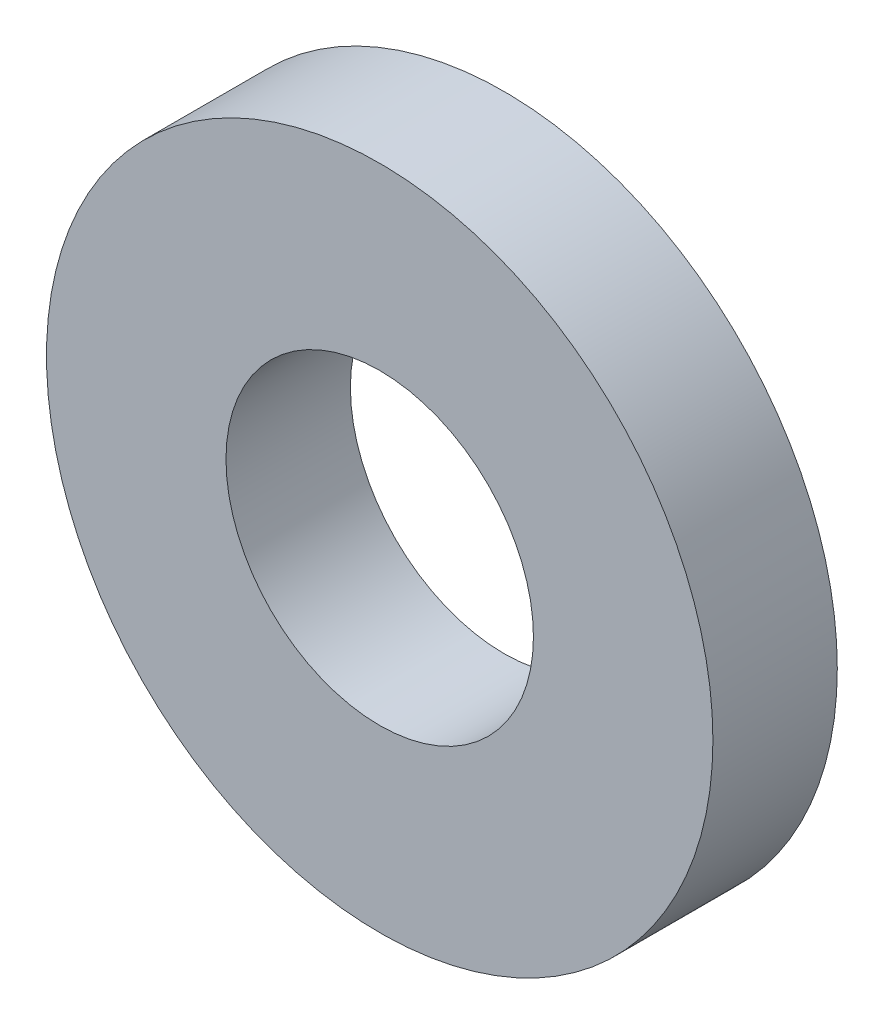
ISO-10303-21;
HEADER;
FILE_DESCRIPTION(('STEP AP214'),'2;1');
FILE_NAME('part.step','',(''),(''),'','','');
FILE_SCHEMA(('AUTOMOTIVE_DESIGN { 1 0 10303 214 1 1 1 1 }'));
ENDSEC;
DATA;
#1=APPLICATION_CONTEXT('core data for automotive mechanical design processes');
#2=APPLICATION_PROTOCOL_DEFINITION('international standard','automotive_design',2000,#1);
#3=PRODUCT_CONTEXT('',#1,'mechanical');
#4=PRODUCT('Part','Part','',(#3));
#5=PRODUCT_RELATED_PRODUCT_CATEGORY('part','',(#4));
#6=PRODUCT_DEFINITION_FORMATION('','',#4);
#7=PRODUCT_DEFINITION_CONTEXT('part definition',#1,'design');
#8=PRODUCT_DEFINITION('design','',#6,#7);
#9=PRODUCT_DEFINITION_SHAPE('','',#8);
#10=(LENGTH_UNIT() NAMED_UNIT(*) SI_UNIT(.MILLI.,.METRE.));
#11=(NAMED_UNIT(*) PLANE_ANGLE_UNIT() SI_UNIT($,.RADIAN.));
#12=(NAMED_UNIT(*) SI_UNIT($,.STERADIAN.) SOLID_ANGLE_UNIT());
#13=UNCERTAINTY_MEASURE_WITH_UNIT(LENGTH_MEASURE(1.E-05),#10,'distance_accuracy_value','');
#14=(GEOMETRIC_REPRESENTATION_CONTEXT(3) GLOBAL_UNCERTAINTY_ASSIGNED_CONTEXT((#13)) GLOBAL_UNIT_ASSIGNED_CONTEXT((#10,
#11,#12)) REPRESENTATION_CONTEXT('',''));
#15=CARTESIAN_POINT('',(0.,0.,0.));
#16=DIRECTION('',(0.,0.,1.));
#17=DIRECTION('',(1.,0.,0.));
#18=AXIS2_PLACEMENT_3D('',#15,#16,#17);
#19=CARTESIAN_POINT('',(0.,0.,0.888999999999999));
#20=DIRECTION('',(0.,0.,1.));
#21=DIRECTION('',(1.,0.,0.));
#22=AXIS2_PLACEMENT_3D('',#19,#20,#21);
#23=PLANE('',#22);
#24=CARTESIAN_POINT('',(0.,0.,0.888999999999999));
#25=DIRECTION('',(0.,0.,1.));
#26=DIRECTION('',(1.,0.,0.));
#27=AXIS2_PLACEMENT_3D('',#24,#25,#26);
#28=CIRCLE('',#27,4.7625);
#29=CARTESIAN_POINT('',(4.7625,0.,0.888999999999999));
#30=VERTEX_POINT('',#29);
#31=EDGE_CURVE('E10',#30,#30,#28,.T.);
#32=ORIENTED_EDGE('',*,*,#31,.T.);
#33=EDGE_LOOP('',(#32));
#34=FACE_BOUND('',#33,.T.);
#35=CARTESIAN_POINT('',(0.,0.,0.888999999999999));
#36=DIRECTION('',(0.,0.,1.));
#37=DIRECTION('',(1.,0.,0.));
#38=AXIS2_PLACEMENT_3D('',#35,#36,#37);
#39=CIRCLE('',#38,2.1971);
#40=CARTESIAN_POINT('',(2.1971,0.,0.888999999999999));
#41=VERTEX_POINT('',#40);
#42=EDGE_CURVE('E42',#41,#41,#39,.T.);
#43=ORIENTED_EDGE('',*,*,#42,.F.);
#44=EDGE_LOOP('',(#43));
#45=FACE_BOUND('',#44,.T.);
#46=ADVANCED_FACE('F35',(#34,#45),#23,.T.);
#47=CARTESIAN_POINT('',(0.,0.,0.888999999999999));
#48=DIRECTION('',(0.,0.,-1.));
#49=DIRECTION('',(-1.,0.,0.));
#50=AXIS2_PLACEMENT_3D('',#47,#48,#49);
#51=CYLINDRICAL_SURFACE('',#50,4.7625);
#52=ORIENTED_EDGE('',*,*,#31,.F.);
#53=EDGE_LOOP('',(#52));
#54=FACE_BOUND('',#53,.T.);
#55=CARTESIAN_POINT('',(0.,0.,-0.889000000000001));
#56=DIRECTION('',(0.,0.,1.));
#57=DIRECTION('',(1.,0.,0.));
#58=AXIS2_PLACEMENT_3D('',#55,#56,#57);
#59=CIRCLE('',#58,4.7625);
#60=CARTESIAN_POINT('',(4.7625,0.,-0.889000000000001));
#61=VERTEX_POINT('',#60);
#62=EDGE_CURVE('E46',#61,#61,#59,.T.);
#63=ORIENTED_EDGE('',*,*,#62,.T.);
#64=EDGE_LOOP('',(#63));
#65=FACE_BOUND('',#64,.T.);
#66=ADVANCED_FACE('F37',(#54,#65),#51,.T.);
#67=CARTESIAN_POINT('',(0.,0.,0.888999999999999));
#68=DIRECTION('',(0.,0.,-1.));
#69=DIRECTION('',(-1.,0.,0.));
#70=AXIS2_PLACEMENT_3D('',#67,#68,#69);
#71=CYLINDRICAL_SURFACE('',#70,2.1971);
#72=ORIENTED_EDGE('',*,*,#42,.T.);
#73=EDGE_LOOP('',(#72));
#74=FACE_BOUND('',#73,.T.);
#75=CARTESIAN_POINT('',(0.,0.,-0.889000000000001));
#76=DIRECTION('',(0.,0.,1.));
#77=DIRECTION('',(1.,0.,0.));
#78=AXIS2_PLACEMENT_3D('',#75,#76,#77);
#79=CIRCLE('',#78,2.1971);
#80=CARTESIAN_POINT('',(2.1971,0.,-0.889000000000001));
#81=VERTEX_POINT('',#80);
#82=EDGE_CURVE('E50',#81,#81,#79,.T.);
#83=ORIENTED_EDGE('',*,*,#82,.F.);
#84=EDGE_LOOP('',(#83));
#85=FACE_BOUND('',#84,.T.);
#86=ADVANCED_FACE('F59',(#74,#85),#71,.F.);
#87=CARTESIAN_POINT('',(0.,0.,-0.889000000000001));
#88=DIRECTION('',(0.,0.,1.));
#89=DIRECTION('',(1.,0.,0.));
#90=AXIS2_PLACEMENT_3D('',#87,#88,#89);
#91=PLANE('',#90);
#92=ORIENTED_EDGE('',*,*,#82,.T.);
#93=EDGE_LOOP('',(#92));
#94=FACE_BOUND('',#93,.T.);
#95=ORIENTED_EDGE('',*,*,#62,.F.);
#96=EDGE_LOOP('',(#95));
#97=FACE_BOUND('',#96,.T.);
#98=ADVANCED_FACE('F56',(#94,#97),#91,.F.);
#99=CLOSED_SHELL('',(#46,#66,#86,#98));
#100=MANIFOLD_SOLID_BREP('B2',#99);
#101=ADVANCED_BREP_SHAPE_REPRESENTATION('',(#18,#100),#14);
#102=SHAPE_DEFINITION_REPRESENTATION(#9,#101);
ENDSEC;
END-ISO-10303-21;
